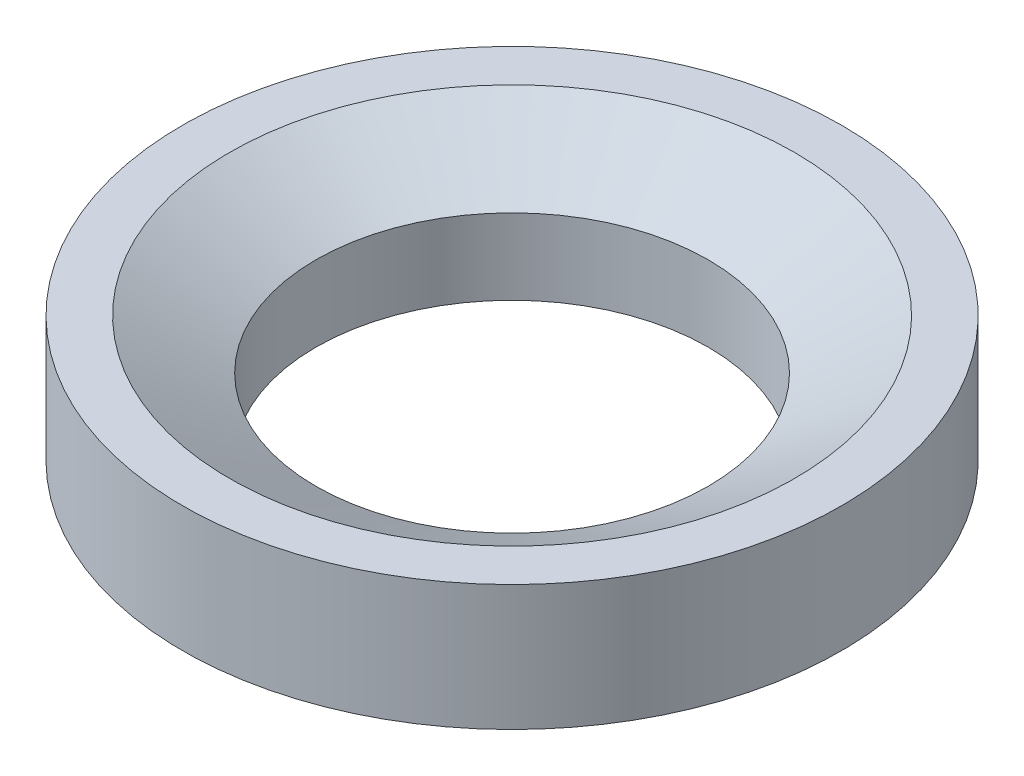
ISO-10303-21;
HEADER;
FILE_DESCRIPTION(('STEP AP214'),'2;1');
FILE_NAME('part.step','',(''),(''),'','','');
FILE_SCHEMA(('AUTOMOTIVE_DESIGN { 1 0 10303 214 1 1 1 1 }'));
ENDSEC;
DATA;
#1=APPLICATION_CONTEXT('core data for automotive mechanical design processes');
#2=APPLICATION_PROTOCOL_DEFINITION('international standard','automotive_design',2000,#1);
#3=PRODUCT_CONTEXT('',#1,'mechanical');
#4=PRODUCT('Part','Part','',(#3));
#5=PRODUCT_RELATED_PRODUCT_CATEGORY('part','',(#4));
#6=PRODUCT_DEFINITION_FORMATION('','',#4);
#7=PRODUCT_DEFINITION_CONTEXT('part definition',#1,'design');
#8=PRODUCT_DEFINITION('design','',#6,#7);
#9=PRODUCT_DEFINITION_SHAPE('','',#8);
#10=(LENGTH_UNIT() NAMED_UNIT(*) SI_UNIT(.MILLI.,.METRE.));
#11=(NAMED_UNIT(*) PLANE_ANGLE_UNIT() SI_UNIT($,.RADIAN.));
#12=(NAMED_UNIT(*) SI_UNIT($,.STERADIAN.) SOLID_ANGLE_UNIT());
#13=UNCERTAINTY_MEASURE_WITH_UNIT(LENGTH_MEASURE(1.E-05),#10,'distance_accuracy_value','');
#14=(GEOMETRIC_REPRESENTATION_CONTEXT(3) GLOBAL_UNCERTAINTY_ASSIGNED_CONTEXT((#13)) GLOBAL_UNIT_ASSIGNED_CONTEXT((#10,
#11,#12)) REPRESENTATION_CONTEXT('',''));
#15=CARTESIAN_POINT('',(0.,0.,0.));
#16=DIRECTION('',(0.,0.,1.));
#17=DIRECTION('',(1.,0.,0.));
#18=AXIS2_PLACEMENT_3D('',#15,#16,#17);
#19=CARTESIAN_POINT('',(0.,-2.,0.));
#20=DIRECTION('',(0.,-1.,0.));
#21=DIRECTION('',(0.,0.,-1.));
#22=AXIS2_PLACEMENT_3D('',#19,#20,#21);
#23=CYLINDRICAL_SURFACE('',#22,10.5);
#24=CARTESIAN_POINT('',(0.,-2.,0.));
#25=DIRECTION('',(0.,-1.,0.));
#26=DIRECTION('',(0.,0.,-1.));
#27=AXIS2_PLACEMENT_3D('',#24,#25,#26);
#28=CIRCLE('',#27,10.5);
#29=CARTESIAN_POINT('',(0.,-2.,-10.5));
#30=VERTEX_POINT('',#29);
#31=EDGE_CURVE('E52',#30,#30,#28,.T.);
#32=ORIENTED_EDGE('',*,*,#31,.F.);
#33=EDGE_LOOP('',(#32));
#34=FACE_BOUND('',#33,.T.);
#35=CARTESIAN_POINT('',(0.,2.,0.));
#36=DIRECTION('',(0.,-1.,0.));
#37=DIRECTION('',(0.,0.,-1.));
#38=AXIS2_PLACEMENT_3D('',#35,#36,#37);
#39=CIRCLE('',#38,10.5);
#40=CARTESIAN_POINT('',(0.,2.,-10.5));
#41=VERTEX_POINT('',#40);
#42=EDGE_CURVE('E10',#41,#41,#39,.T.);
#43=ORIENTED_EDGE('',*,*,#42,.T.);
#44=EDGE_LOOP('',(#43));
#45=FACE_BOUND('',#44,.T.);
#46=ADVANCED_FACE('F33',(#34,#45),#23,.T.);
#47=CARTESIAN_POINT('',(0.,2.,10.5));
#48=DIRECTION('',(0.,-1.,0.));
#49=DIRECTION('',(0.,0.,-1.));
#50=AXIS2_PLACEMENT_3D('',#47,#48,#49);
#51=PLANE('',#50);
#52=ORIENTED_EDGE('',*,*,#42,.F.);
#53=EDGE_LOOP('',(#52));
#54=FACE_BOUND('',#53,.T.);
#55=CARTESIAN_POINT('',(0.,2.,0.));
#56=DIRECTION('',(0.,-1.,0.));
#57=DIRECTION('',(0.,0.,-1.));
#58=AXIS2_PLACEMENT_3D('',#55,#56,#57);
#59=CIRCLE('',#58,9.);
#60=CARTESIAN_POINT('',(0.,2.,-9.));
#61=VERTEX_POINT('',#60);
#62=EDGE_CURVE('E39',#61,#61,#59,.T.);
#63=ORIENTED_EDGE('',*,*,#62,.T.);
#64=EDGE_LOOP('',(#63));
#65=FACE_BOUND('',#64,.T.);
#66=ADVANCED_FACE('F59',(#54,#65),#51,.F.);
#67=CARTESIAN_POINT('',(0.,0.412286759728514,0.));
#68=DIRECTION('',(0.,1.,0.));
#69=DIRECTION('',(0.,0.,1.));
#70=AXIS2_PLACEMENT_3D('',#67,#68,#69);
#71=CONICAL_SURFACE('',#70,6.25,1.04719755119659);
#72=ORIENTED_EDGE('',*,*,#62,.F.);
#73=EDGE_LOOP('',(#72));
#74=FACE_BOUND('',#73,.T.);
#75=CARTESIAN_POINT('',(0.,0.412286759728514,0.));
#76=DIRECTION('',(0.,-1.,0.));
#77=DIRECTION('',(0.,0.,-1.));
#78=AXIS2_PLACEMENT_3D('',#75,#76,#77);
#79=CIRCLE('',#78,6.25);
#80=CARTESIAN_POINT('',(0.,0.412286759728515,-6.25));
#81=VERTEX_POINT('',#80);
#82=EDGE_CURVE('E43',#81,#81,#79,.T.);
#83=ORIENTED_EDGE('',*,*,#82,.T.);
#84=EDGE_LOOP('',(#83));
#85=FACE_BOUND('',#84,.T.);
#86=ADVANCED_FACE('F63',(#74,#85),#71,.F.);
#87=CARTESIAN_POINT('',(0.,-2.,0.));
#88=DIRECTION('',(0.,-1.,0.));
#89=DIRECTION('',(0.,0.,-1.));
#90=AXIS2_PLACEMENT_3D('',#87,#88,#89);
#91=CYLINDRICAL_SURFACE('',#90,6.25);
#92=ORIENTED_EDGE('',*,*,#82,.F.);
#93=EDGE_LOOP('',(#92));
#94=FACE_BOUND('',#93,.T.);
#95=CARTESIAN_POINT('',(0.,-2.,0.));
#96=DIRECTION('',(0.,-1.,0.));
#97=DIRECTION('',(0.,0.,-1.));
#98=AXIS2_PLACEMENT_3D('',#95,#96,#97);
#99=CIRCLE('',#98,6.25);
#100=CARTESIAN_POINT('',(0.,-2.,-6.25));
#101=VERTEX_POINT('',#100);
#102=EDGE_CURVE('E47',#101,#101,#99,.T.);
#103=ORIENTED_EDGE('',*,*,#102,.T.);
#104=EDGE_LOOP('',(#103));
#105=FACE_BOUND('',#104,.T.);
#106=ADVANCED_FACE('F68',(#94,#105),#91,.F.);
#107=CARTESIAN_POINT('',(0.,-2.,6.25));
#108=DIRECTION('',(0.,1.,0.));
#109=DIRECTION('',(0.,0.,1.));
#110=AXIS2_PLACEMENT_3D('',#107,#108,#109);
#111=PLANE('',#110);
#112=ORIENTED_EDGE('',*,*,#102,.F.);
#113=EDGE_LOOP('',(#112));
#114=FACE_BOUND('',#113,.T.);
#115=ORIENTED_EDGE('',*,*,#31,.T.);
#116=EDGE_LOOP('',(#115));
#117=FACE_BOUND('',#116,.T.);
#118=ADVANCED_FACE('F56',(#114,#117),#111,.F.);
#119=CLOSED_SHELL('',(#46,#66,#86,#106,#118));
#120=MANIFOLD_SOLID_BREP('B2',#119);
#121=ADVANCED_BREP_SHAPE_REPRESENTATION('',(#18,#120),#14);
#122=SHAPE_DEFINITION_REPRESENTATION(#9,#121);
ENDSEC;
END-ISO-10303-21;
